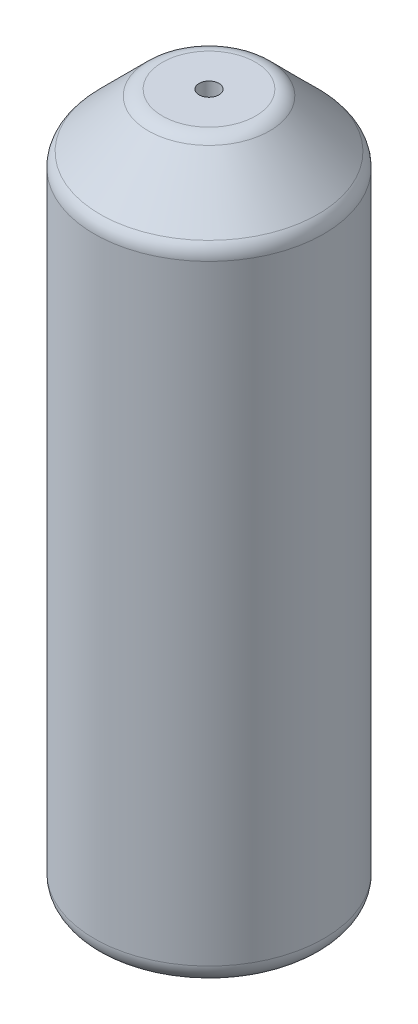
ISO-10303-21;
HEADER;
FILE_DESCRIPTION(('STEP AP214'),'2;1');
FILE_NAME('part.step','',(''),(''),'','','');
FILE_SCHEMA(('AUTOMOTIVE_DESIGN { 1 0 10303 214 1 1 1 1 }'));
ENDSEC;
DATA;
#1=APPLICATION_CONTEXT('core data for automotive mechanical design processes');
#2=APPLICATION_PROTOCOL_DEFINITION('international standard','automotive_design',2000,#1);
#3=PRODUCT_CONTEXT('',#1,'mechanical');
#4=PRODUCT('Part','Part','',(#3));
#5=PRODUCT_RELATED_PRODUCT_CATEGORY('part','',(#4));
#6=PRODUCT_DEFINITION_FORMATION('','',#4);
#7=PRODUCT_DEFINITION_CONTEXT('part definition',#1,'design');
#8=PRODUCT_DEFINITION('design','',#6,#7);
#9=PRODUCT_DEFINITION_SHAPE('','',#8);
#10=(LENGTH_UNIT() NAMED_UNIT(*) SI_UNIT(.MILLI.,.METRE.));
#11=(NAMED_UNIT(*) PLANE_ANGLE_UNIT() SI_UNIT($,.RADIAN.));
#12=(NAMED_UNIT(*) SI_UNIT($,.STERADIAN.) SOLID_ANGLE_UNIT());
#13=UNCERTAINTY_MEASURE_WITH_UNIT(LENGTH_MEASURE(1.E-05),#10,'distance_accuracy_value','');
#14=(GEOMETRIC_REPRESENTATION_CONTEXT(3) GLOBAL_UNCERTAINTY_ASSIGNED_CONTEXT((#13)) GLOBAL_UNIT_ASSIGNED_CONTEXT((#10,
#11,#12)) REPRESENTATION_CONTEXT('',''));
#15=CARTESIAN_POINT('',(0.,0.,0.));
#16=DIRECTION('',(0.,0.,1.));
#17=DIRECTION('',(1.,0.,0.));
#18=AXIS2_PLACEMENT_3D('',#15,#16,#17);
#19=CARTESIAN_POINT('',(4.125,0.,0.));
#20=DIRECTION('',(0.,-1.,0.));
#21=DIRECTION('',(1.,0.,0.));
#22=AXIS2_PLACEMENT_3D('',#19,#20,#21);
#23=PLANE('',#22);
#24=CARTESIAN_POINT('',(0.,0.,0.));
#25=DIRECTION('',(0.,-1.,0.));
#26=DIRECTION('',(1.,0.,0.));
#27=AXIS2_PLACEMENT_3D('',#24,#25,#26);
#28=CIRCLE('',#27,4.62500000000014);
#29=CARTESIAN_POINT('',(4.62500000000014,0.,0.));
#30=VERTEX_POINT('',#29);
#31=EDGE_CURVE('E10',#30,#30,#28,.F.);
#32=ORIENTED_EDGE('',*,*,#31,.T.);
#33=EDGE_LOOP('',(#32));
#34=FACE_BOUND('',#33,.T.);
#35=CARTESIAN_POINT('',(0.,0.,0.));
#36=DIRECTION('',(0.,-1.,0.));
#37=DIRECTION('',(1.,0.,0.));
#38=AXIS2_PLACEMENT_3D('',#35,#36,#37);
#39=CIRCLE('',#38,4.75000000000006);
#40=CARTESIAN_POINT('',(4.75000000000006,0.,0.));
#41=VERTEX_POINT('',#40);
#42=EDGE_CURVE('E69',#41,#41,#39,.T.);
#43=ORIENTED_EDGE('',*,*,#42,.T.);
#44=EDGE_LOOP('',(#43));
#45=FACE_BOUND('',#44,.T.);
#46=ADVANCED_FACE('F39',(#34,#45),#23,.T.);
#47=CARTESIAN_POINT('',(3.43024899888577E-12,-1000.,0.));
#48=DIRECTION('',(0.,-1.,0.));
#49=DIRECTION('',(1.,0.,0.));
#50=AXIS2_PLACEMENT_3D('',#47,#48,#49);
#51=CYLINDRICAL_SURFACE('',#50,5.75000000000006);
#52=CARTESIAN_POINT('',(0.,0.99999999999989,0.));
#53=DIRECTION('',(0.,-1.,0.));
#54=DIRECTION('',(1.,0.,0.));
#55=AXIS2_PLACEMENT_3D('',#52,#53,#54);
#56=CIRCLE('',#55,5.75000000000006);
#57=CARTESIAN_POINT('',(5.75000000000006,0.99999999999991,0.));
#58=VERTEX_POINT('',#57);
#59=EDGE_CURVE('E63',#58,#58,#56,.F.);
#60=ORIENTED_EDGE('',*,*,#59,.T.);
#61=EDGE_LOOP('',(#60));
#62=FACE_BOUND('',#61,.T.);
#63=CARTESIAN_POINT('',(-1.0834711230669E-13,31.585786437627,0.));
#64=DIRECTION('',(0.,1.,0.));
#65=DIRECTION('',(-1.,0.,0.));
#66=AXIS2_PLACEMENT_3D('',#63,#64,#65);
#67=CIRCLE('',#66,5.75000000000006);
#68=CARTESIAN_POINT('',(-5.75000000000017,31.585786437627,0.));
#69=VERTEX_POINT('',#68);
#70=EDGE_CURVE('E66',#69,#69,#67,.F.);
#71=ORIENTED_EDGE('',*,*,#70,.T.);
#72=EDGE_LOOP('',(#71));
#73=FACE_BOUND('',#72,.T.);
#74=ADVANCED_FACE('F118',(#62,#73),#51,.T.);
#75=CARTESIAN_POINT('',(0.5,35.,0.));
#76=DIRECTION('',(0.,1.,0.));
#77=DIRECTION('',(-1.,0.,0.));
#78=AXIS2_PLACEMENT_3D('',#75,#76,#77);
#79=PLANE('',#78);
#80=CARTESIAN_POINT('',(-1.20058714961002E-13,35.,0.));
#81=DIRECTION('',(0.,1.,0.));
#82=DIRECTION('',(-1.,0.,0.));
#83=AXIS2_PLACEMENT_3D('',#80,#81,#82);
#84=CIRCLE('',#83,2.33578643762696);
#85=CARTESIAN_POINT('',(-2.33578643762708,35.,0.));
#86=VERTEX_POINT('',#85);
#87=EDGE_CURVE('E60',#86,#86,#84,.T.);
#88=ORIENTED_EDGE('',*,*,#87,.T.);
#89=EDGE_LOOP('',(#88));
#90=FACE_BOUND('',#89,.T.);
#91=CARTESIAN_POINT('',(-1.20058714961002E-13,34.9999999999999,0.));
#92=DIRECTION('',(0.,-1.,0.));
#93=DIRECTION('',(1.,0.,0.));
#94=AXIS2_PLACEMENT_3D('',#91,#92,#93);
#95=CIRCLE('',#94,0.50000000000012);
#96=CARTESIAN_POINT('',(0.5,34.9999999999999,0.));
#97=VERTEX_POINT('',#96);
#98=EDGE_CURVE('E72',#97,#97,#95,.T.);
#99=ORIENTED_EDGE('',*,*,#98,.T.);
#100=EDGE_LOOP('',(#99));
#101=FACE_BOUND('',#100,.T.);
#102=ADVANCED_FACE('F124',(#90,#101),#79,.T.);
#103=CARTESIAN_POINT('',(3.43024899888577E-12,-1000.,0.));
#104=DIRECTION('',(0.,-1.,0.));
#105=DIRECTION('',(1.,0.,0.));
#106=AXIS2_PLACEMENT_3D('',#103,#104,#105);
#107=CYLINDRICAL_SURFACE('',#106,0.500000000000117);
#108=CARTESIAN_POINT('',(-1.14619072620885E-13,33.414213562373,0.));
#109=DIRECTION('',(0.,-1.,0.));
#110=DIRECTION('',(1.,0.,0.));
#111=AXIS2_PLACEMENT_3D('',#108,#109,#110);
#112=CIRCLE('',#111,0.500000000000115);
#113=CARTESIAN_POINT('',(0.5,33.414213562373,0.));
#114=VERTEX_POINT('',#113);
#115=EDGE_CURVE('E75',#114,#114,#112,.T.);
#116=ORIENTED_EDGE('',*,*,#115,.T.);
#117=EDGE_LOOP('',(#116));
#118=FACE_BOUND('',#117,.T.);
#119=ORIENTED_EDGE('',*,*,#98,.F.);
#120=EDGE_LOOP('',(#119));
#121=FACE_BOUND('',#120,.T.);
#122=ADVANCED_FACE('F245',(#118,#121),#107,.F.);
#123=CARTESIAN_POINT('',(-1.14708589848966E-13,33.414213562373,0.));
#124=DIRECTION('',(0.,-1.,0.));
#125=DIRECTION('',(1.,0.,0.));
#126=AXIS2_PLACEMENT_3D('',#123,#124,#125);
#127=TOROIDAL_SURFACE('',#126,1.50000000000011,1.);
#128=CARTESIAN_POINT('',(-1.12193520292615E-13,32.7071067811864,0.));
#129=DIRECTION('',(0.,-1.,0.));
#130=DIRECTION('',(1.,0.,0.));
#131=AXIS2_PLACEMENT_3D('',#128,#129,#130);
#132=CIRCLE('',#131,0.792893218813565);
#133=CARTESIAN_POINT('',(0.792893218813453,32.7071067811864,0.));
#134=VERTEX_POINT('',#133);
#135=EDGE_CURVE('E78',#134,#134,#132,.T.);
#136=ORIENTED_EDGE('',*,*,#135,.T.);
#137=EDGE_LOOP('',(#136));
#138=FACE_BOUND('',#137,.T.);
#139=ORIENTED_EDGE('',*,*,#115,.F.);
#140=EDGE_LOOP('',(#139));
#141=FACE_BOUND('',#140,.T.);
#142=ADVANCED_FACE('F235',(#138,#141),#127,.T.);
#143=CARTESIAN_POINT('',(-1.12193520292615E-13,32.7071067811864,0.));
#144=DIRECTION('',(0.,-1.,0.));
#145=DIRECTION('',(1.,0.,0.));
#146=AXIS2_PLACEMENT_3D('',#143,#144,#145);
#147=CONICAL_SURFACE('',#146,0.792893218813565,0.78539816339751);
#148=CARTESIAN_POINT('',(-1.09057540135517E-13,31.7928932188134,0.));
#149=DIRECTION('',(0.,-1.,0.));
#150=DIRECTION('',(1.,0.,0.));
#151=AXIS2_PLACEMENT_3D('',#148,#149,#150);
#152=CIRCLE('',#151,1.70710678118666);
#153=CARTESIAN_POINT('',(1.70710678118655,31.7928932188134,0.));
#154=VERTEX_POINT('',#153);
#155=EDGE_CURVE('E81',#154,#154,#152,.T.);
#156=ORIENTED_EDGE('',*,*,#155,.T.);
#157=EDGE_LOOP('',(#156));
#158=FACE_BOUND('',#157,.T.);
#159=ORIENTED_EDGE('',*,*,#135,.F.);
#160=EDGE_LOOP('',(#159));
#161=FACE_BOUND('',#160,.T.);
#162=ADVANCED_FACE('F225',(#158,#161),#147,.F.);
#163=CARTESIAN_POINT('',(-1.06685493772574E-13,31.0857864376268,0.));
#164=DIRECTION('',(0.,-1.,0.));
#165=DIRECTION('',(1.,0.,0.));
#166=AXIS2_PLACEMENT_3D('',#163,#164,#165);
#167=TOROIDAL_SURFACE('',#166,1.00000000000011,1.);
#168=CARTESIAN_POINT('',(-1.06631987807247E-13,31.0857864376268,0.));
#169=DIRECTION('',(0.,-1.,0.));
#170=DIRECTION('',(1.,0.,0.));
#171=AXIS2_PLACEMENT_3D('',#168,#169,#170);
#172=CIRCLE('',#171,2.00000000000011);
#173=CARTESIAN_POINT('',(2.,31.0857864376268,0.));
#174=VERTEX_POINT('',#173);
#175=EDGE_CURVE('E84',#174,#174,#172,.T.);
#176=ORIENTED_EDGE('',*,*,#175,.T.);
#177=EDGE_LOOP('',(#176));
#178=FACE_BOUND('',#177,.T.);
#179=ORIENTED_EDGE('',*,*,#155,.F.);
#180=EDGE_LOOP('',(#179));
#181=FACE_BOUND('',#180,.T.);
#182=ADVANCED_FACE('F215',(#178,#181),#167,.F.);
#183=CARTESIAN_POINT('',(3.43024899888577E-12,-1000.,0.));
#184=DIRECTION('',(0.,-1.,0.));
#185=DIRECTION('',(1.,0.,0.));
#186=AXIS2_PLACEMENT_3D('',#183,#184,#185);
#187=CYLINDRICAL_SURFACE('',#186,2.0000000000001);
#188=CARTESIAN_POINT('',(0.,26.,0.));
#189=DIRECTION('',(0.,-1.,0.));
#190=DIRECTION('',(1.,0.,0.));
#191=AXIS2_PLACEMENT_3D('',#188,#189,#190);
#192=CIRCLE('',#191,2.00000000000009);
#193=CARTESIAN_POINT('',(2.,26.,0.));
#194=VERTEX_POINT('',#193);
#195=EDGE_CURVE('E87',#194,#194,#192,.T.);
#196=ORIENTED_EDGE('',*,*,#195,.T.);
#197=EDGE_LOOP('',(#196));
#198=FACE_BOUND('',#197,.T.);
#199=ORIENTED_EDGE('',*,*,#175,.F.);
#200=EDGE_LOOP('',(#199));
#201=FACE_BOUND('',#200,.T.);
#202=ADVANCED_FACE('F205',(#198,#201),#187,.F.);
#203=CARTESIAN_POINT('',(0.,26.,0.));
#204=DIRECTION('',(0.,-1.,0.));
#205=DIRECTION('',(1.,0.,0.));
#206=AXIS2_PLACEMENT_3D('',#203,#204,#205);
#207=TOROIDAL_SURFACE('',#206,3.00000000000009,1.);
#208=CARTESIAN_POINT('',(0.,24.9999999999999,0.));
#209=DIRECTION('',(0.,-1.,0.));
#210=DIRECTION('',(1.,0.,0.));
#211=AXIS2_PLACEMENT_3D('',#208,#209,#210);
#212=CIRCLE('',#211,3.00000000000009);
#213=CARTESIAN_POINT('',(3.,24.9999999999999,0.));
#214=VERTEX_POINT('',#213);
#215=EDGE_CURVE('E90',#214,#214,#212,.T.);
#216=ORIENTED_EDGE('',*,*,#215,.T.);
#217=EDGE_LOOP('',(#216));
#218=FACE_BOUND('',#217,.T.);
#219=ORIENTED_EDGE('',*,*,#195,.F.);
#220=EDGE_LOOP('',(#219));
#221=FACE_BOUND('',#220,.T.);
#222=ADVANCED_FACE('F195',(#218,#221),#207,.T.);
#223=CARTESIAN_POINT('',(3.125,25.,0.));
#224=DIRECTION('',(0.,-1.,0.));
#225=DIRECTION('',(1.,0.,0.));
#226=AXIS2_PLACEMENT_3D('',#223,#224,#225);
#227=PLANE('',#226);
#228=CARTESIAN_POINT('',(0.,24.9999999999999,0.));
#229=DIRECTION('',(0.,-1.,0.));
#230=DIRECTION('',(1.,0.,0.));
#231=AXIS2_PLACEMENT_3D('',#228,#229,#230);
#232=CIRCLE('',#231,3.12500000000008);
#233=CARTESIAN_POINT('',(3.125,24.9999999999999,0.));
#234=VERTEX_POINT('',#233);
#235=EDGE_CURVE('E93',#234,#234,#232,.T.);
#236=ORIENTED_EDGE('',*,*,#235,.T.);
#237=EDGE_LOOP('',(#236));
#238=FACE_BOUND('',#237,.T.);
#239=ORIENTED_EDGE('',*,*,#215,.F.);
#240=EDGE_LOOP('',(#239));
#241=FACE_BOUND('',#240,.T.);
#242=ADVANCED_FACE('F116',(#238,#241),#227,.T.);
#243=CARTESIAN_POINT('',(0.,24.,0.));
#244=DIRECTION('',(0.,-1.,0.));
#245=DIRECTION('',(1.,0.,0.));
#246=AXIS2_PLACEMENT_3D('',#243,#244,#245);
#247=TOROIDAL_SURFACE('',#246,3.12500000000008,1.);
#248=CARTESIAN_POINT('',(0.,24.,0.));
#249=DIRECTION('',(0.,-1.,0.));
#250=DIRECTION('',(1.,0.,0.));
#251=AXIS2_PLACEMENT_3D('',#248,#249,#250);
#252=CIRCLE('',#251,4.12500000000008);
#253=CARTESIAN_POINT('',(4.125,24.,0.));
#254=VERTEX_POINT('',#253);
#255=EDGE_CURVE('E96',#254,#254,#252,.T.);
#256=ORIENTED_EDGE('',*,*,#255,.T.);
#257=EDGE_LOOP('',(#256));
#258=FACE_BOUND('',#257,.T.);
#259=ORIENTED_EDGE('',*,*,#235,.F.);
#260=EDGE_LOOP('',(#259));
#261=FACE_BOUND('',#260,.T.);
#262=ADVANCED_FACE('F100',(#258,#261),#247,.F.);
#263=CARTESIAN_POINT('',(3.43024899888577E-12,-1000.,0.));
#264=DIRECTION('',(0.,-1.,0.));
#265=DIRECTION('',(1.,0.,0.));
#266=AXIS2_PLACEMENT_3D('',#263,#264,#265);
#267=CYLINDRICAL_SURFACE('',#266,4.12500000000004);
#268=CARTESIAN_POINT('',(0.,0.500000000000167,0.));
#269=DIRECTION('',(0.,-1.,0.));
#270=DIRECTION('',(1.,0.,0.));
#271=AXIS2_PLACEMENT_3D('',#268,#269,#270);
#272=CIRCLE('',#271,4.12500000000004);
#273=CARTESIAN_POINT('',(4.12500000000004,0.500000000000181,0.));
#274=VERTEX_POINT('',#273);
#275=EDGE_CURVE('E47',#274,#274,#272,.T.);
#276=ORIENTED_EDGE('',*,*,#275,.T.);
#277=EDGE_LOOP('',(#276));
#278=FACE_BOUND('',#277,.T.);
#279=ORIENTED_EDGE('',*,*,#255,.F.);
#280=EDGE_LOOP('',(#279));
#281=FACE_BOUND('',#280,.T.);
#282=ADVANCED_FACE('F103',(#278,#281),#267,.F.);
#283=CARTESIAN_POINT('',(-1.09767967964345E-13,32.,0.));
#284=DIRECTION('',(0.,-1.,0.));
#285=DIRECTION('',(1.,0.,0.));
#286=AXIS2_PLACEMENT_3D('',#283,#284,#285);
#287=CONICAL_SURFACE('',#286,5.75000000000006,0.785398163397462);
#288=CARTESIAN_POINT('',(-1.19054018290387E-13,34.7071067811865,0.));
#289=DIRECTION('',(0.,1.,0.));
#290=DIRECTION('',(-1.,0.,0.));
#291=AXIS2_PLACEMENT_3D('',#288,#289,#290);
#292=CIRCLE('',#291,3.0428932188135);
#293=CARTESIAN_POINT('',(-3.04289321881362,34.7071067811865,0.));
#294=VERTEX_POINT('',#293);
#295=EDGE_CURVE('E51',#294,#294,#292,.F.);
#296=ORIENTED_EDGE('',*,*,#295,.T.);
#297=EDGE_LOOP('',(#296));
#298=FACE_BOUND('',#297,.T.);
#299=CARTESIAN_POINT('',(-1.1077266463496E-13,32.2928932188135,0.));
#300=DIRECTION('',(0.,1.,0.));
#301=DIRECTION('',(-1.,0.,0.));
#302=AXIS2_PLACEMENT_3D('',#299,#300,#301);
#303=CIRCLE('',#302,5.45710678118656);
#304=CARTESIAN_POINT('',(-5.45710678118667,32.2928932188135,0.));
#305=VERTEX_POINT('',#304);
#306=EDGE_CURVE('E55',#305,#305,#303,.T.);
#307=ORIENTED_EDGE('',*,*,#306,.T.);
#308=EDGE_LOOP('',(#307));
#309=FACE_BOUND('',#308,.T.);
#310=ADVANCED_FACE('F105',(#298,#309),#287,.T.);
#311=CARTESIAN_POINT('',(0.,0.99999999999989,0.));
#312=DIRECTION('',(0.,-1.,0.));
#313=DIRECTION('',(1.,0.,0.));
#314=AXIS2_PLACEMENT_3D('',#311,#312,#313);
#315=TOROIDAL_SURFACE('',#314,4.75000000000006,1.);
#316=ORIENTED_EDGE('',*,*,#59,.F.);
#317=EDGE_LOOP('',(#316));
#318=FACE_BOUND('',#317,.T.);
#319=ORIENTED_EDGE('',*,*,#42,.F.);
#320=EDGE_LOOP('',(#319));
#321=FACE_BOUND('',#320,.T.);
#322=ADVANCED_FACE('F112',(#318,#321),#315,.T.);
#323=CARTESIAN_POINT('',(-1.16628465962116E-13,34.,0.));
#324=DIRECTION('',(0.,1.,0.));
#325=DIRECTION('',(-1.,0.,0.));
#326=AXIS2_PLACEMENT_3D('',#323,#324,#325);
#327=TOROIDAL_SURFACE('',#326,2.33578643762696,1.);
#328=ORIENTED_EDGE('',*,*,#295,.F.);
#329=EDGE_LOOP('',(#328));
#330=FACE_BOUND('',#329,.T.);
#331=ORIENTED_EDGE('',*,*,#87,.F.);
#332=EDGE_LOOP('',(#331));
#333=FACE_BOUND('',#332,.T.);
#334=ADVANCED_FACE('F135',(#330,#333),#327,.T.);
#335=CARTESIAN_POINT('',(-1.0834711230669E-13,31.585786437627,0.));
#336=DIRECTION('',(0.,1.,0.));
#337=DIRECTION('',(-1.,0.,0.));
#338=AXIS2_PLACEMENT_3D('',#335,#336,#337);
#339=TOROIDAL_SURFACE('',#338,4.75000000000006,1.);
#340=ORIENTED_EDGE('',*,*,#306,.F.);
#341=EDGE_LOOP('',(#340));
#342=FACE_BOUND('',#341,.T.);
#343=ORIENTED_EDGE('',*,*,#70,.F.);
#344=EDGE_LOOP('',(#343));
#345=FACE_BOUND('',#344,.T.);
#346=ADVANCED_FACE('F138',(#342,#345),#339,.T.);
#347=CARTESIAN_POINT('',(0.,0.500000000000167,0.));
#348=DIRECTION('',(0.,-1.,0.));
#349=DIRECTION('',(1.,0.,0.));
#350=AXIS2_PLACEMENT_3D('',#347,#348,#349);
#351=CONICAL_SURFACE('',#350,4.12500000000004,0.785398163397362);
#352=ORIENTED_EDGE('',*,*,#31,.F.);
#353=EDGE_LOOP('',(#352));
#354=FACE_BOUND('',#353,.T.);
#355=ORIENTED_EDGE('',*,*,#275,.F.);
#356=EDGE_LOOP('',(#355));
#357=FACE_BOUND('',#356,.T.);
#358=ADVANCED_FACE('F42',(#354,#357),#351,.F.);
#359=CLOSED_SHELL('',(#46,#74,#102,#122,#142,#162,#182,#202,#222,#242,#262,#282,#310,#322,#334,
#346,#358));
#360=MANIFOLD_SOLID_BREP('B2',#359);
#361=ADVANCED_BREP_SHAPE_REPRESENTATION('',(#18,#360),#14);
#362=SHAPE_DEFINITION_REPRESENTATION(#9,#361);
ENDSEC;
END-ISO-10303-21;
